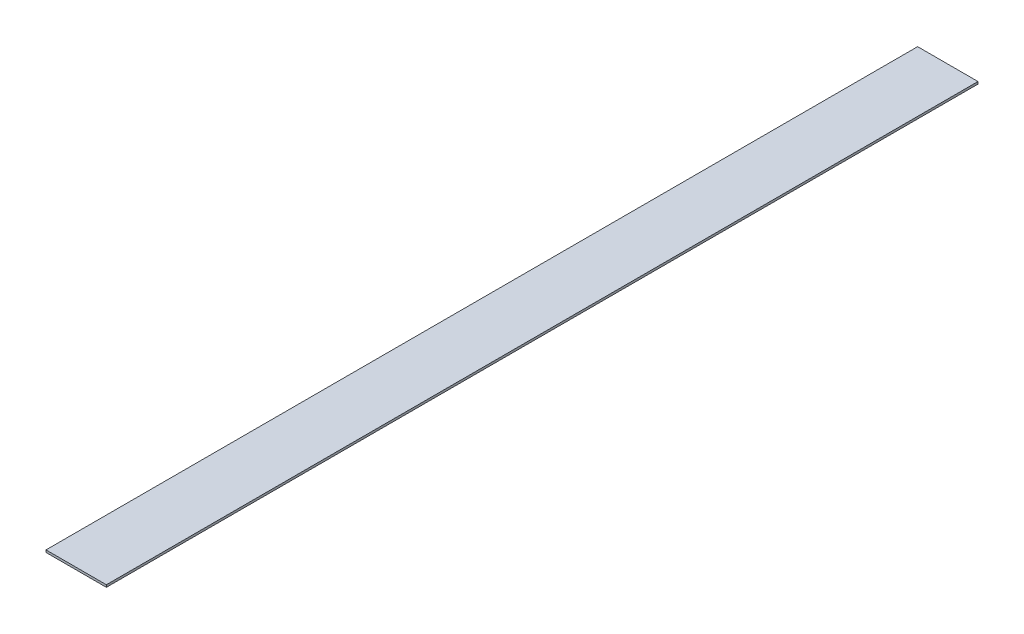
ISO-10303-21;
HEADER;
FILE_DESCRIPTION(('STEP AP214'),'2;1');
FILE_NAME('part.step','',(''),(''),'','','');
FILE_SCHEMA(('AUTOMOTIVE_DESIGN { 1 0 10303 214 1 1 1 1 }'));
ENDSEC;
DATA;
#1=APPLICATION_CONTEXT('core data for automotive mechanical design processes');
#2=APPLICATION_PROTOCOL_DEFINITION('international standard','automotive_design',2000,#1);
#3=PRODUCT_CONTEXT('',#1,'mechanical');
#4=PRODUCT('Part','Part','',(#3));
#5=PRODUCT_RELATED_PRODUCT_CATEGORY('part','',(#4));
#6=PRODUCT_DEFINITION_FORMATION('','',#4);
#7=PRODUCT_DEFINITION_CONTEXT('part definition',#1,'design');
#8=PRODUCT_DEFINITION('design','',#6,#7);
#9=PRODUCT_DEFINITION_SHAPE('','',#8);
#10=(LENGTH_UNIT() NAMED_UNIT(*) SI_UNIT(.MILLI.,.METRE.));
#11=(NAMED_UNIT(*) PLANE_ANGLE_UNIT() SI_UNIT($,.RADIAN.));
#12=(NAMED_UNIT(*) SI_UNIT($,.STERADIAN.) SOLID_ANGLE_UNIT());
#13=UNCERTAINTY_MEASURE_WITH_UNIT(LENGTH_MEASURE(1.E-05),#10,'distance_accuracy_value','');
#14=(GEOMETRIC_REPRESENTATION_CONTEXT(3) GLOBAL_UNCERTAINTY_ASSIGNED_CONTEXT((#13)) GLOBAL_UNIT_ASSIGNED_CONTEXT((#10,
#11,#12)) REPRESENTATION_CONTEXT('',''));
#15=CARTESIAN_POINT('',(0.,0.,0.));
#16=DIRECTION('',(0.,0.,1.));
#17=DIRECTION('',(1.,0.,0.));
#18=AXIS2_PLACEMENT_3D('',#15,#16,#17);
#19=CARTESIAN_POINT('',(0.,0.,577.5));
#20=DIRECTION('',(1.,0.,0.));
#21=DIRECTION('',(0.,0.,-1.));
#22=AXIS2_PLACEMENT_3D('',#19,#20,#21);
#23=PLANE('',#22);
#24=DIRECTION('',(0.,-1.,0.));
#25=VECTOR('',#24,1.);
#26=CARTESIAN_POINT('',(0.,0.,0.));
#27=LINE('',#26,#25);
#28=CARTESIAN_POINT('',(0.,1.5,0.));
#29=VERTEX_POINT('',#28);
#30=CARTESIAN_POINT('',(0.,0.,0.));
#31=VERTEX_POINT('',#30);
#32=EDGE_CURVE('E96',#29,#31,#27,.T.);
#33=ORIENTED_EDGE('',*,*,#32,.T.);
#34=DIRECTION('',(0.,0.,-1.));
#35=VECTOR('',#34,1.);
#36=CARTESIAN_POINT('',(0.,0.,577.5));
#37=LINE('',#36,#35);
#38=CARTESIAN_POINT('',(0.,0.,577.5));
#39=VERTEX_POINT('',#38);
#40=EDGE_CURVE('E11',#39,#31,#37,.T.);
#41=ORIENTED_EDGE('',*,*,#40,.F.);
#42=DIRECTION('',(0.,-1.,0.));
#43=VECTOR('',#42,1.);
#44=CARTESIAN_POINT('',(0.,0.,577.5));
#45=LINE('',#44,#43);
#46=CARTESIAN_POINT('',(0.,1.5,577.5));
#47=VERTEX_POINT('',#46);
#48=EDGE_CURVE('E84',#47,#39,#45,.T.);
#49=ORIENTED_EDGE('',*,*,#48,.F.);
#50=DIRECTION('',(0.,0.,-1.));
#51=VECTOR('',#50,1.);
#52=CARTESIAN_POINT('',(0.,1.5,577.5));
#53=LINE('',#52,#51);
#54=EDGE_CURVE('E92',#47,#29,#53,.T.);
#55=ORIENTED_EDGE('',*,*,#54,.T.);
#56=EDGE_LOOP('',(#33,#41,#49,#55));
#57=FACE_BOUND('',#56,.T.);
#58=ADVANCED_FACE('F33',(#57),#23,.F.);
#59=CARTESIAN_POINT('',(0.,0.,577.5));
#60=DIRECTION('',(0.,1.,0.));
#61=DIRECTION('',(0.,0.,1.));
#62=AXIS2_PLACEMENT_3D('',#59,#60,#61);
#63=PLANE('',#62);
#64=DIRECTION('',(1.,0.,0.));
#65=VECTOR('',#64,1.);
#66=CARTESIAN_POINT('',(0.,0.,0.));
#67=LINE('',#66,#65);
#68=CARTESIAN_POINT('',(40.,0.,0.));
#69=VERTEX_POINT('',#68);
#70=EDGE_CURVE('E88',#31,#69,#67,.T.);
#71=ORIENTED_EDGE('',*,*,#70,.T.);
#72=DIRECTION('',(0.,0.,-1.));
#73=VECTOR('',#72,1.);
#74=CARTESIAN_POINT('',(40.,0.,577.5));
#75=LINE('',#74,#73);
#76=CARTESIAN_POINT('',(40.,0.,577.5));
#77=VERTEX_POINT('',#76);
#78=EDGE_CURVE('E41',#77,#69,#75,.T.);
#79=ORIENTED_EDGE('',*,*,#78,.F.);
#80=DIRECTION('',(1.,0.,0.));
#81=VECTOR('',#80,1.);
#82=CARTESIAN_POINT('',(0.,0.,577.5));
#83=LINE('',#82,#81);
#84=EDGE_CURVE('E79',#39,#77,#83,.T.);
#85=ORIENTED_EDGE('',*,*,#84,.F.);
#86=ORIENTED_EDGE('',*,*,#40,.T.);
#87=EDGE_LOOP('',(#71,#79,#85,#86));
#88=FACE_BOUND('',#87,.T.);
#89=ADVANCED_FACE('F87',(#88),#63,.F.);
#90=CARTESIAN_POINT('',(40.,0.,577.5));
#91=DIRECTION('',(-1.,0.,0.));
#92=DIRECTION('',(0.,0.,1.));
#93=AXIS2_PLACEMENT_3D('',#90,#91,#92);
#94=PLANE('',#93);
#95=DIRECTION('',(0.,1.,0.));
#96=VECTOR('',#95,1.);
#97=CARTESIAN_POINT('',(40.,0.,0.));
#98=LINE('',#97,#96);
#99=CARTESIAN_POINT('',(40.,1.5,0.));
#100=VERTEX_POINT('',#99);
#101=EDGE_CURVE('E66',#69,#100,#98,.T.);
#102=ORIENTED_EDGE('',*,*,#101,.T.);
#103=DIRECTION('',(0.,0.,-1.));
#104=VECTOR('',#103,1.);
#105=CARTESIAN_POINT('',(40.,1.5,577.5));
#106=LINE('',#105,#104);
#107=CARTESIAN_POINT('',(40.,1.5,577.5));
#108=VERTEX_POINT('',#107);
#109=EDGE_CURVE('E89',#108,#100,#106,.T.);
#110=ORIENTED_EDGE('',*,*,#109,.F.);
#111=DIRECTION('',(0.,1.,0.));
#112=VECTOR('',#111,1.);
#113=CARTESIAN_POINT('',(40.,0.,577.5));
#114=LINE('',#113,#112);
#115=EDGE_CURVE('E82',#77,#108,#114,.T.);
#116=ORIENTED_EDGE('',*,*,#115,.F.);
#117=ORIENTED_EDGE('',*,*,#78,.T.);
#118=EDGE_LOOP('',(#102,#110,#116,#117));
#119=FACE_BOUND('',#118,.T.);
#120=ADVANCED_FACE('F90',(#119),#94,.F.);
#121=CARTESIAN_POINT('',(0.,1.5,577.5));
#122=DIRECTION('',(0.,-1.,0.));
#123=DIRECTION('',(0.,0.,-1.));
#124=AXIS2_PLACEMENT_3D('',#121,#122,#123);
#125=PLANE('',#124);
#126=DIRECTION('',(-1.,0.,0.));
#127=VECTOR('',#126,1.);
#128=CARTESIAN_POINT('',(0.,1.5,0.));
#129=LINE('',#128,#127);
#130=EDGE_CURVE('E72',#100,#29,#129,.T.);
#131=ORIENTED_EDGE('',*,*,#130,.T.);
#132=ORIENTED_EDGE('',*,*,#54,.F.);
#133=DIRECTION('',(-1.,0.,0.));
#134=VECTOR('',#133,1.);
#135=CARTESIAN_POINT('',(0.,1.5,577.5));
#136=LINE('',#135,#134);
#137=EDGE_CURVE('E49',#108,#47,#136,.T.);
#138=ORIENTED_EDGE('',*,*,#137,.F.);
#139=ORIENTED_EDGE('',*,*,#109,.T.);
#140=EDGE_LOOP('',(#131,#132,#138,#139));
#141=FACE_BOUND('',#140,.T.);
#142=ADVANCED_FACE('F103',(#141),#125,.F.);
#143=CARTESIAN_POINT('',(0.,0.,577.5));
#144=DIRECTION('',(0.,0.,-1.));
#145=DIRECTION('',(-1.,0.,0.));
#146=AXIS2_PLACEMENT_3D('',#143,#144,#145);
#147=PLANE('',#146);
#148=ORIENTED_EDGE('',*,*,#48,.T.);
#149=ORIENTED_EDGE('',*,*,#84,.T.);
#150=ORIENTED_EDGE('',*,*,#115,.T.);
#151=ORIENTED_EDGE('',*,*,#137,.T.);
#152=EDGE_LOOP('',(#148,#149,#150,#151));
#153=FACE_BOUND('',#152,.T.);
#154=ADVANCED_FACE('F80',(#153),#147,.F.);
#155=CARTESIAN_POINT('',(0.,0.,0.));
#156=DIRECTION('',(0.,0.,-1.));
#157=DIRECTION('',(-1.,0.,0.));
#158=AXIS2_PLACEMENT_3D('',#155,#156,#157);
#159=PLANE('',#158);
#160=ORIENTED_EDGE('',*,*,#32,.F.);
#161=ORIENTED_EDGE('',*,*,#130,.F.);
#162=ORIENTED_EDGE('',*,*,#101,.F.);
#163=ORIENTED_EDGE('',*,*,#70,.F.);
#164=EDGE_LOOP('',(#160,#161,#162,#163));
#165=FACE_BOUND('',#164,.T.);
#166=ADVANCED_FACE('F106',(#165),#159,.T.);
#167=CLOSED_SHELL('',(#58,#89,#120,#142,#154,#166));
#168=MANIFOLD_SOLID_BREP('B2',#167);
#169=ADVANCED_BREP_SHAPE_REPRESENTATION('',(#18,#168),#14);
#170=SHAPE_DEFINITION_REPRESENTATION(#9,#169);
ENDSEC;
END-ISO-10303-21;
